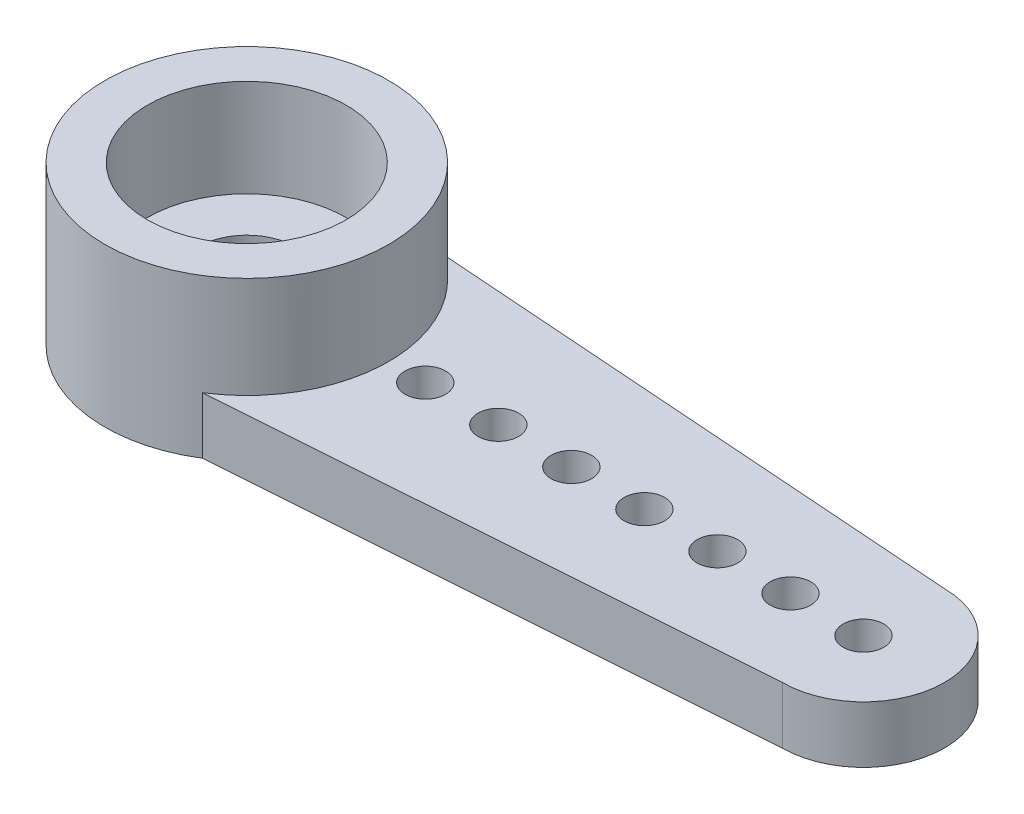
ISO-10303-21;
HEADER;
FILE_DESCRIPTION(('STEP AP214'),'2;1');
FILE_NAME('part.step','',(''),(''),'','','');
FILE_SCHEMA(('AUTOMOTIVE_DESIGN { 1 0 10303 214 1 1 1 1 }'));
ENDSEC;
DATA;
#1=APPLICATION_CONTEXT('core data for automotive mechanical design processes');
#2=APPLICATION_PROTOCOL_DEFINITION('international standard','automotive_design',2000,#1);
#3=PRODUCT_CONTEXT('',#1,'mechanical');
#4=PRODUCT('Part','Part','',(#3));
#5=PRODUCT_RELATED_PRODUCT_CATEGORY('part','',(#4));
#6=PRODUCT_DEFINITION_FORMATION('','',#4);
#7=PRODUCT_DEFINITION_CONTEXT('part definition',#1,'design');
#8=PRODUCT_DEFINITION('design','',#6,#7);
#9=PRODUCT_DEFINITION_SHAPE('','',#8);
#10=(LENGTH_UNIT() NAMED_UNIT(*) SI_UNIT(.MILLI.,.METRE.));
#11=(NAMED_UNIT(*) PLANE_ANGLE_UNIT() SI_UNIT($,.RADIAN.));
#12=(NAMED_UNIT(*) SI_UNIT($,.STERADIAN.) SOLID_ANGLE_UNIT());
#13=UNCERTAINTY_MEASURE_WITH_UNIT(LENGTH_MEASURE(1.E-05),#10,'distance_accuracy_value','');
#14=(GEOMETRIC_REPRESENTATION_CONTEXT(3) GLOBAL_UNCERTAINTY_ASSIGNED_CONTEXT((#13)) GLOBAL_UNIT_ASSIGNED_CONTEXT((#10,
#11,#12)) REPRESENTATION_CONTEXT('',''));
#15=CARTESIAN_POINT('',(0.,0.,0.));
#16=DIRECTION('',(0.,0.,1.));
#17=DIRECTION('',(1.,0.,0.));
#18=AXIS2_PLACEMENT_3D('',#15,#16,#17);
#19=CARTESIAN_POINT('',(-15.2,1.4,0.));
#20=DIRECTION('',(0.,1.,0.));
#21=DIRECTION('',(0.,0.,1.));
#22=AXIS2_PLACEMENT_3D('',#19,#20,#21);
#23=PLANE('',#22);
#24=CARTESIAN_POINT('',(6.2,1.4,0.));
#25=DIRECTION('',(0.,1.,0.));
#26=DIRECTION('',(0.,0.,1.));
#27=AXIS2_PLACEMENT_3D('',#24,#25,#26);
#28=CIRCLE('',#27,0.499999999999997);
#29=CARTESIAN_POINT('',(6.2,1.4,0.500000000000053));
#30=VERTEX_POINT('',#29);
#31=EDGE_CURVE('E129',#30,#30,#28,.T.);
#32=ORIENTED_EDGE('',*,*,#31,.F.);
#33=EDGE_LOOP('',(#32));
#34=FACE_BOUND('',#33,.T.);
#35=CARTESIAN_POINT('',(9.8,1.4,0.));
#36=DIRECTION('',(0.,1.,0.));
#37=DIRECTION('',(0.,0.,1.));
#38=AXIS2_PLACEMENT_3D('',#35,#36,#37);
#39=CIRCLE('',#38,0.499999999999997);
#40=CARTESIAN_POINT('',(9.8,1.4,0.500000000000028));
#41=VERTEX_POINT('',#40);
#42=EDGE_CURVE('E141',#41,#41,#39,.T.);
#43=ORIENTED_EDGE('',*,*,#42,.F.);
#44=EDGE_LOOP('',(#43));
#45=FACE_BOUND('',#44,.T.);
#46=CARTESIAN_POINT('',(13.4,1.4,0.));
#47=DIRECTION('',(0.,1.,0.));
#48=DIRECTION('',(0.,0.,1.));
#49=AXIS2_PLACEMENT_3D('',#46,#47,#48);
#50=CIRCLE('',#49,0.499999999999997);
#51=CARTESIAN_POINT('',(13.4,1.4,0.500000000000003));
#52=VERTEX_POINT('',#51);
#53=EDGE_CURVE('E153',#52,#52,#50,.T.);
#54=ORIENTED_EDGE('',*,*,#53,.F.);
#55=EDGE_LOOP('',(#54));
#56=FACE_BOUND('',#55,.T.);
#57=CARTESIAN_POINT('',(15.2,1.4,0.));
#58=DIRECTION('',(0.,1.,0.));
#59=DIRECTION('',(0.,0.,1.));
#60=AXIS2_PLACEMENT_3D('',#57,#58,#59);
#61=CIRCLE('',#60,0.499999999999997);
#62=CARTESIAN_POINT('',(15.2,1.4,0.49999999999999));
#63=VERTEX_POINT('',#62);
#64=EDGE_CURVE('E159',#63,#63,#61,.T.);
#65=ORIENTED_EDGE('',*,*,#64,.F.);
#66=EDGE_LOOP('',(#65));
#67=FACE_BOUND('',#66,.T.);
#68=CARTESIAN_POINT('',(11.6,1.4,0.));
#69=DIRECTION('',(0.,1.,0.));
#70=DIRECTION('',(0.,0.,1.));
#71=AXIS2_PLACEMENT_3D('',#68,#69,#70);
#72=CIRCLE('',#71,0.499999999999999);
#73=CARTESIAN_POINT('',(11.6,1.4,0.500000000000017));
#74=VERTEX_POINT('',#73);
#75=EDGE_CURVE('E147',#74,#74,#72,.T.);
#76=ORIENTED_EDGE('',*,*,#75,.F.);
#77=EDGE_LOOP('',(#76));
#78=FACE_BOUND('',#77,.T.);
#79=CARTESIAN_POINT('',(8.,1.4,0.));
#80=DIRECTION('',(0.,1.,0.));
#81=DIRECTION('',(0.,0.,1.));
#82=AXIS2_PLACEMENT_3D('',#79,#80,#81);
#83=CIRCLE('',#82,0.499999999999997);
#84=CARTESIAN_POINT('',(8.,1.4,0.500000000000041));
#85=VERTEX_POINT('',#84);
#86=EDGE_CURVE('E135',#85,#85,#83,.T.);
#87=ORIENTED_EDGE('',*,*,#86,.F.);
#88=EDGE_LOOP('',(#87));
#89=FACE_BOUND('',#88,.T.);
#90=CARTESIAN_POINT('',(4.4,1.4,0.));
#91=DIRECTION('',(0.,1.,0.));
#92=DIRECTION('',(0.,0.,1.));
#93=AXIS2_PLACEMENT_3D('',#90,#91,#92);
#94=CIRCLE('',#93,0.499999999999997);
#95=CARTESIAN_POINT('',(4.4,1.4,0.500000000000066));
#96=VERTEX_POINT('',#95);
#97=EDGE_CURVE('E123',#96,#96,#94,.T.);
#98=ORIENTED_EDGE('',*,*,#97,.F.);
#99=EDGE_LOOP('',(#98));
#100=FACE_BOUND('',#99,.T.);
#101=CARTESIAN_POINT('',(0.,1.4,0.));
#102=DIRECTION('',(0.,1.,0.));
#103=DIRECTION('',(0.,0.,1.));
#104=AXIS2_PLACEMENT_3D('',#101,#102,#103);
#105=CIRCLE('',#104,3.5);
#106=CARTESIAN_POINT('',(1.86858471289894,1.4,2.95945791838985));
#107=VERTEX_POINT('',#106);
#108=CARTESIAN_POINT('',(1.86858471289894,1.4,-2.95945791838985));
#109=VERTEX_POINT('',#108);
#110=EDGE_CURVE('E89',#107,#109,#105,.T.);
#111=ORIENTED_EDGE('',*,*,#110,.F.);
#112=DIRECTION('',(0.997420198870011,0.,-0.0717840294641297));
#113=VECTOR('',#112,1.);
#114=CARTESIAN_POINT('',(-14.9001527327747,1.4,4.16629887091939));
#115=LINE('',#114,#113);
#116=CARTESIAN_POINT('',(15.2,1.4,2.));
#117=VERTEX_POINT('',#116);
#118=EDGE_CURVE('E103',#107,#117,#115,.T.);
#119=ORIENTED_EDGE('',*,*,#118,.T.);
#120=CARTESIAN_POINT('',(15.2,1.4,0.));
#121=DIRECTION('',(0.,1.,0.));
#122=DIRECTION('',(0.,0.,-1.));
#123=AXIS2_PLACEMENT_3D('',#120,#121,#122);
#124=CIRCLE('',#123,2.);
#125=CARTESIAN_POINT('',(15.2,1.4,-2.));
#126=VERTEX_POINT('',#125);
#127=EDGE_CURVE('E165',#117,#126,#124,.T.);
#128=ORIENTED_EDGE('',*,*,#127,.T.);
#129=DIRECTION('',(-0.997420198870011,0.,-0.0717840294641295));
#130=VECTOR('',#129,1.);
#131=CARTESIAN_POINT('',(-14.9001527327747,1.4,-4.16629887091939));
#132=LINE('',#131,#130);
#133=EDGE_CURVE('E100',#126,#109,#132,.T.);
#134=ORIENTED_EDGE('',*,*,#133,.T.);
#135=EDGE_LOOP('',(#111,#119,#128,#134));
#136=FACE_BOUND('',#135,.T.);
#137=ADVANCED_FACE('F36',(#34,#45,#56,#67,#78,#89,#100,#136),#23,.T.);
#138=CARTESIAN_POINT('',(-15.2,0.,0.));
#139=DIRECTION('',(0.,1.,0.));
#140=DIRECTION('',(0.,0.,1.));
#141=AXIS2_PLACEMENT_3D('',#138,#139,#140);
#142=PLANE('',#141);
#143=CARTESIAN_POINT('',(0.,0.,0.));
#144=DIRECTION('',(0.,-1.,0.));
#145=DIRECTION('',(0.,0.,-1.));
#146=AXIS2_PLACEMENT_3D('',#143,#144,#145);
#147=CIRCLE('',#146,2.35);
#148=CARTESIAN_POINT('',(0.,0.,-2.35));
#149=VERTEX_POINT('',#148);
#150=EDGE_CURVE('E115',#149,#149,#147,.T.);
#151=ORIENTED_EDGE('',*,*,#150,.F.);
#152=EDGE_LOOP('',(#151));
#153=FACE_BOUND('',#152,.T.);
#154=CARTESIAN_POINT('',(15.2,0.,0.));
#155=DIRECTION('',(0.,1.,0.));
#156=DIRECTION('',(0.,0.,1.));
#157=AXIS2_PLACEMENT_3D('',#154,#155,#156);
#158=CIRCLE('',#157,0.499999999999997);
#159=CARTESIAN_POINT('',(15.2,0.,0.49999999999999));
#160=VERTEX_POINT('',#159);
#161=EDGE_CURVE('E156',#160,#160,#158,.T.);
#162=ORIENTED_EDGE('',*,*,#161,.T.);
#163=EDGE_LOOP('',(#162));
#164=FACE_BOUND('',#163,.T.);
#165=CARTESIAN_POINT('',(13.4,0.,0.));
#166=DIRECTION('',(0.,1.,0.));
#167=DIRECTION('',(0.,0.,1.));
#168=AXIS2_PLACEMENT_3D('',#165,#166,#167);
#169=CIRCLE('',#168,0.499999999999997);
#170=CARTESIAN_POINT('',(13.4,0.,0.500000000000003));
#171=VERTEX_POINT('',#170);
#172=EDGE_CURVE('E150',#171,#171,#169,.T.);
#173=ORIENTED_EDGE('',*,*,#172,.T.);
#174=EDGE_LOOP('',(#173));
#175=FACE_BOUND('',#174,.T.);
#176=CARTESIAN_POINT('',(11.6,0.,0.));
#177=DIRECTION('',(0.,1.,0.));
#178=DIRECTION('',(0.,0.,1.));
#179=AXIS2_PLACEMENT_3D('',#176,#177,#178);
#180=CIRCLE('',#179,0.499999999999999);
#181=CARTESIAN_POINT('',(11.6,0.,0.500000000000017));
#182=VERTEX_POINT('',#181);
#183=EDGE_CURVE('E144',#182,#182,#180,.T.);
#184=ORIENTED_EDGE('',*,*,#183,.T.);
#185=EDGE_LOOP('',(#184));
#186=FACE_BOUND('',#185,.T.);
#187=CARTESIAN_POINT('',(9.8,0.,0.));
#188=DIRECTION('',(0.,1.,0.));
#189=DIRECTION('',(0.,0.,1.));
#190=AXIS2_PLACEMENT_3D('',#187,#188,#189);
#191=CIRCLE('',#190,0.499999999999997);
#192=CARTESIAN_POINT('',(9.8,0.,0.500000000000028));
#193=VERTEX_POINT('',#192);
#194=EDGE_CURVE('E138',#193,#193,#191,.T.);
#195=ORIENTED_EDGE('',*,*,#194,.T.);
#196=EDGE_LOOP('',(#195));
#197=FACE_BOUND('',#196,.T.);
#198=CARTESIAN_POINT('',(8.,0.,0.));
#199=DIRECTION('',(0.,1.,0.));
#200=DIRECTION('',(0.,0.,1.));
#201=AXIS2_PLACEMENT_3D('',#198,#199,#200);
#202=CIRCLE('',#201,0.499999999999997);
#203=CARTESIAN_POINT('',(8.,0.,0.500000000000041));
#204=VERTEX_POINT('',#203);
#205=EDGE_CURVE('E132',#204,#204,#202,.T.);
#206=ORIENTED_EDGE('',*,*,#205,.T.);
#207=EDGE_LOOP('',(#206));
#208=FACE_BOUND('',#207,.T.);
#209=CARTESIAN_POINT('',(6.2,0.,0.));
#210=DIRECTION('',(0.,1.,0.));
#211=DIRECTION('',(0.,0.,1.));
#212=AXIS2_PLACEMENT_3D('',#209,#210,#211);
#213=CIRCLE('',#212,0.499999999999997);
#214=CARTESIAN_POINT('',(6.2,0.,0.500000000000053));
#215=VERTEX_POINT('',#214);
#216=EDGE_CURVE('E126',#215,#215,#213,.T.);
#217=ORIENTED_EDGE('',*,*,#216,.T.);
#218=EDGE_LOOP('',(#217));
#219=FACE_BOUND('',#218,.T.);
#220=CARTESIAN_POINT('',(4.4,0.,0.));
#221=DIRECTION('',(0.,1.,0.));
#222=DIRECTION('',(0.,0.,1.));
#223=AXIS2_PLACEMENT_3D('',#220,#221,#222);
#224=CIRCLE('',#223,0.499999999999997);
#225=CARTESIAN_POINT('',(4.4,0.,0.500000000000066));
#226=VERTEX_POINT('',#225);
#227=EDGE_CURVE('E120',#226,#226,#224,.T.);
#228=ORIENTED_EDGE('',*,*,#227,.T.);
#229=EDGE_LOOP('',(#228));
#230=FACE_BOUND('',#229,.T.);
#231=CARTESIAN_POINT('',(0.,0.,0.));
#232=DIRECTION('',(0.,-1.,0.));
#233=DIRECTION('',(0.,0.,-1.));
#234=AXIS2_PLACEMENT_3D('',#231,#232,#233);
#235=CIRCLE('',#234,3.5);
#236=CARTESIAN_POINT('',(1.86858471289894,0.,2.95945791838985));
#237=VERTEX_POINT('',#236);
#238=CARTESIAN_POINT('',(1.86858471289894,0.,-2.95945791838985));
#239=VERTEX_POINT('',#238);
#240=EDGE_CURVE('E74',#237,#239,#235,.T.);
#241=ORIENTED_EDGE('',*,*,#240,.T.);
#242=DIRECTION('',(0.997420198870011,0.,0.0717840294641295));
#243=VECTOR('',#242,1.);
#244=CARTESIAN_POINT('',(1.86858471289894,0.,-2.95945791838985));
#245=LINE('',#244,#243);
#246=CARTESIAN_POINT('',(15.2,0.,-2.));
#247=VERTEX_POINT('',#246);
#248=EDGE_CURVE('E79',#239,#247,#245,.T.);
#249=ORIENTED_EDGE('',*,*,#248,.T.);
#250=CARTESIAN_POINT('',(15.2,0.,0.));
#251=DIRECTION('',(0.,1.,0.));
#252=DIRECTION('',(0.,0.,-1.));
#253=AXIS2_PLACEMENT_3D('',#250,#251,#252);
#254=CIRCLE('',#253,2.);
#255=CARTESIAN_POINT('',(15.2,0.,1.99999999999999));
#256=VERTEX_POINT('',#255);
#257=EDGE_CURVE('E162',#256,#247,#254,.T.);
#258=ORIENTED_EDGE('',*,*,#257,.F.);
#259=DIRECTION('',(-0.997420198870011,0.,0.0717840294641296));
#260=VECTOR('',#259,1.);
#261=CARTESIAN_POINT('',(15.2,0.,2.));
#262=LINE('',#261,#260);
#263=EDGE_CURVE('E51',#256,#237,#262,.T.);
#264=ORIENTED_EDGE('',*,*,#263,.T.);
#265=EDGE_LOOP('',(#241,#249,#258,#264));
#266=FACE_BOUND('',#265,.T.);
#267=ADVANCED_FACE('F76',(#153,#164,#175,#186,#197,#208,#219,#230,#266),#142,.F.);
#268=CARTESIAN_POINT('',(15.2,1.4,0.));
#269=DIRECTION('',(0.,-1.,0.));
#270=DIRECTION('',(0.,0.,-1.));
#271=AXIS2_PLACEMENT_3D('',#268,#269,#270);
#272=CYLINDRICAL_SURFACE('',#271,2.);
#273=ORIENTED_EDGE('',*,*,#257,.T.);
#274=DIRECTION('',(0.,-1.,0.));
#275=VECTOR('',#274,1.);
#276=CARTESIAN_POINT('',(15.2,1.4,-2.00000000000001));
#277=LINE('',#276,#275);
#278=EDGE_CURVE('E96',#126,#247,#277,.T.);
#279=ORIENTED_EDGE('',*,*,#278,.F.);
#280=ORIENTED_EDGE('',*,*,#127,.F.);
#281=DIRECTION('',(0.,-1.,0.));
#282=VECTOR('',#281,1.);
#283=CARTESIAN_POINT('',(15.2,1.4,1.99999999999999));
#284=LINE('',#283,#282);
#285=EDGE_CURVE('E44',#117,#256,#284,.T.);
#286=ORIENTED_EDGE('',*,*,#285,.T.);
#287=EDGE_LOOP('',(#273,#279,#280,#286));
#288=FACE_BOUND('',#287,.T.);
#289=ADVANCED_FACE('F38',(#288),#272,.T.);
#290=CARTESIAN_POINT('',(15.2,1.4,0.));
#291=DIRECTION('',(0.,-1.,0.));
#292=DIRECTION('',(0.,0.,-1.));
#293=AXIS2_PLACEMENT_3D('',#290,#291,#292);
#294=CYLINDRICAL_SURFACE('',#293,0.499999999999997);
#295=ORIENTED_EDGE('',*,*,#64,.T.);
#296=EDGE_LOOP('',(#295));
#297=FACE_BOUND('',#296,.T.);
#298=ORIENTED_EDGE('',*,*,#161,.F.);
#299=EDGE_LOOP('',(#298));
#300=FACE_BOUND('',#299,.T.);
#301=ADVANCED_FACE('F224',(#297,#300),#294,.F.);
#302=CARTESIAN_POINT('',(13.4,1.4,0.));
#303=DIRECTION('',(0.,-1.,0.));
#304=DIRECTION('',(0.,0.,-1.));
#305=AXIS2_PLACEMENT_3D('',#302,#303,#304);
#306=CYLINDRICAL_SURFACE('',#305,0.499999999999997);
#307=ORIENTED_EDGE('',*,*,#53,.T.);
#308=EDGE_LOOP('',(#307));
#309=FACE_BOUND('',#308,.T.);
#310=ORIENTED_EDGE('',*,*,#172,.F.);
#311=EDGE_LOOP('',(#310));
#312=FACE_BOUND('',#311,.T.);
#313=ADVANCED_FACE('F227',(#309,#312),#306,.F.);
#314=CARTESIAN_POINT('',(11.6,1.4,0.));
#315=DIRECTION('',(0.,-1.,0.));
#316=DIRECTION('',(0.,0.,-1.));
#317=AXIS2_PLACEMENT_3D('',#314,#315,#316);
#318=CYLINDRICAL_SURFACE('',#317,0.499999999999999);
#319=ORIENTED_EDGE('',*,*,#75,.T.);
#320=EDGE_LOOP('',(#319));
#321=FACE_BOUND('',#320,.T.);
#322=ORIENTED_EDGE('',*,*,#183,.F.);
#323=EDGE_LOOP('',(#322));
#324=FACE_BOUND('',#323,.T.);
#325=ADVANCED_FACE('F231',(#321,#324),#318,.F.);
#326=CARTESIAN_POINT('',(9.8,1.4,0.));
#327=DIRECTION('',(0.,-1.,0.));
#328=DIRECTION('',(0.,0.,-1.));
#329=AXIS2_PLACEMENT_3D('',#326,#327,#328);
#330=CYLINDRICAL_SURFACE('',#329,0.499999999999997);
#331=ORIENTED_EDGE('',*,*,#42,.T.);
#332=EDGE_LOOP('',(#331));
#333=FACE_BOUND('',#332,.T.);
#334=ORIENTED_EDGE('',*,*,#194,.F.);
#335=EDGE_LOOP('',(#334));
#336=FACE_BOUND('',#335,.T.);
#337=ADVANCED_FACE('F235',(#333,#336),#330,.F.);
#338=CARTESIAN_POINT('',(8.,1.4,0.));
#339=DIRECTION('',(0.,-1.,0.));
#340=DIRECTION('',(0.,0.,-1.));
#341=AXIS2_PLACEMENT_3D('',#338,#339,#340);
#342=CYLINDRICAL_SURFACE('',#341,0.499999999999997);
#343=ORIENTED_EDGE('',*,*,#86,.T.);
#344=EDGE_LOOP('',(#343));
#345=FACE_BOUND('',#344,.T.);
#346=ORIENTED_EDGE('',*,*,#205,.F.);
#347=EDGE_LOOP('',(#346));
#348=FACE_BOUND('',#347,.T.);
#349=ADVANCED_FACE('F213',(#345,#348),#342,.F.);
#350=CARTESIAN_POINT('',(6.2,1.4,0.));
#351=DIRECTION('',(0.,-1.,0.));
#352=DIRECTION('',(0.,0.,-1.));
#353=AXIS2_PLACEMENT_3D('',#350,#351,#352);
#354=CYLINDRICAL_SURFACE('',#353,0.499999999999997);
#355=ORIENTED_EDGE('',*,*,#31,.T.);
#356=EDGE_LOOP('',(#355));
#357=FACE_BOUND('',#356,.T.);
#358=ORIENTED_EDGE('',*,*,#216,.F.);
#359=EDGE_LOOP('',(#358));
#360=FACE_BOUND('',#359,.T.);
#361=ADVANCED_FACE('F207',(#357,#360),#354,.F.);
#362=CARTESIAN_POINT('',(4.4,1.4,0.));
#363=DIRECTION('',(0.,-1.,0.));
#364=DIRECTION('',(0.,0.,-1.));
#365=AXIS2_PLACEMENT_3D('',#362,#363,#364);
#366=CYLINDRICAL_SURFACE('',#365,0.499999999999997);
#367=ORIENTED_EDGE('',*,*,#97,.T.);
#368=EDGE_LOOP('',(#367));
#369=FACE_BOUND('',#368,.T.);
#370=ORIENTED_EDGE('',*,*,#227,.F.);
#371=EDGE_LOOP('',(#370));
#372=FACE_BOUND('',#371,.T.);
#373=ADVANCED_FACE('F186',(#369,#372),#366,.F.);
#374=CARTESIAN_POINT('',(0.,1.,0.));
#375=DIRECTION('',(0.,-1.,0.));
#376=DIRECTION('',(0.,0.,-1.));
#377=AXIS2_PLACEMENT_3D('',#374,#375,#376);
#378=CYLINDRICAL_SURFACE('',#377,2.35);
#379=CARTESIAN_POINT('',(0.,1.,0.));
#380=DIRECTION('',(0.,-1.,0.));
#381=DIRECTION('',(0.,0.,-1.));
#382=AXIS2_PLACEMENT_3D('',#379,#380,#381);
#383=CIRCLE('',#382,2.35);
#384=CARTESIAN_POINT('',(0.,1.,-2.35));
#385=VERTEX_POINT('',#384);
#386=EDGE_CURVE('E117',#385,#385,#383,.T.);
#387=ORIENTED_EDGE('',*,*,#386,.F.);
#388=EDGE_LOOP('',(#387));
#389=FACE_BOUND('',#388,.T.);
#390=ORIENTED_EDGE('',*,*,#150,.T.);
#391=EDGE_LOOP('',(#390));
#392=FACE_BOUND('',#391,.T.);
#393=ADVANCED_FACE('F180',(#389,#392),#378,.F.);
#394=CARTESIAN_POINT('',(0.,1.,0.));
#395=DIRECTION('',(0.,-1.,0.));
#396=DIRECTION('',(0.,0.,-1.));
#397=AXIS2_PLACEMENT_3D('',#394,#395,#396);
#398=PLANE('',#397);
#399=CARTESIAN_POINT('',(0.,1.,0.));
#400=DIRECTION('',(0.,-1.,0.));
#401=DIRECTION('',(0.,0.,-1.));
#402=AXIS2_PLACEMENT_3D('',#399,#400,#401);
#403=CIRCLE('',#402,1.2);
#404=CARTESIAN_POINT('',(0.,1.,-1.2));
#405=VERTEX_POINT('',#404);
#406=EDGE_CURVE('E108',#405,#405,#403,.T.);
#407=ORIENTED_EDGE('',*,*,#406,.F.);
#408=EDGE_LOOP('',(#407));
#409=FACE_BOUND('',#408,.T.);
#410=ORIENTED_EDGE('',*,*,#386,.T.);
#411=EDGE_LOOP('',(#410));
#412=FACE_BOUND('',#411,.T.);
#413=ADVANCED_FACE('F176',(#409,#412),#398,.T.);
#414=CARTESIAN_POINT('',(0.,3.9,0.));
#415=DIRECTION('',(0.,1.,0.));
#416=DIRECTION('',(0.,0.,1.));
#417=AXIS2_PLACEMENT_3D('',#414,#415,#416);
#418=PLANE('',#417);
#419=CARTESIAN_POINT('',(0.,3.9,0.));
#420=DIRECTION('',(0.,1.,0.));
#421=DIRECTION('',(0.,0.,1.));
#422=AXIS2_PLACEMENT_3D('',#419,#420,#421);
#423=CIRCLE('',#422,3.5);
#424=CARTESIAN_POINT('',(0.,3.9,3.5));
#425=VERTEX_POINT('',#424);
#426=EDGE_CURVE('E112',#425,#425,#423,.T.);
#427=ORIENTED_EDGE('',*,*,#426,.T.);
#428=EDGE_LOOP('',(#427));
#429=FACE_BOUND('',#428,.T.);
#430=CARTESIAN_POINT('',(0.,3.9,0.));
#431=DIRECTION('',(0.,1.,0.));
#432=DIRECTION('',(0.,0.,1.));
#433=AXIS2_PLACEMENT_3D('',#430,#431,#432);
#434=CIRCLE('',#433,2.45);
#435=CARTESIAN_POINT('',(0.,3.9,2.45));
#436=VERTEX_POINT('',#435);
#437=EDGE_CURVE('E109',#436,#436,#434,.T.);
#438=ORIENTED_EDGE('',*,*,#437,.F.);
#439=EDGE_LOOP('',(#438));
#440=FACE_BOUND('',#439,.T.);
#441=ADVANCED_FACE('F179',(#429,#440),#418,.T.);
#442=CARTESIAN_POINT('',(0.,3.9,0.));
#443=DIRECTION('',(0.,-1.,0.));
#444=DIRECTION('',(0.,0.,-1.));
#445=AXIS2_PLACEMENT_3D('',#442,#443,#444);
#446=CYLINDRICAL_SURFACE('',#445,3.5);
#447=DIRECTION('',(0.,-1.,0.));
#448=VECTOR('',#447,1.);
#449=CARTESIAN_POINT('',(1.86858471289894,3.9,-2.95945791838985));
#450=LINE('',#449,#448);
#451=EDGE_CURVE('E83',#109,#239,#450,.T.);
#452=ORIENTED_EDGE('',*,*,#451,.T.);
#453=ORIENTED_EDGE('',*,*,#240,.F.);
#454=DIRECTION('',(0.,-1.,0.));
#455=VECTOR('',#454,1.);
#456=CARTESIAN_POINT('',(1.86858471289894,3.9,2.95945791838985));
#457=LINE('',#456,#455);
#458=EDGE_CURVE('E92',#107,#237,#457,.T.);
#459=ORIENTED_EDGE('',*,*,#458,.F.);
#460=ORIENTED_EDGE('',*,*,#110,.T.);
#461=EDGE_LOOP('',(#452,#453,#459,#460));
#462=FACE_BOUND('',#461,.T.);
#463=ORIENTED_EDGE('',*,*,#426,.F.);
#464=EDGE_LOOP('',(#463));
#465=FACE_BOUND('',#464,.T.);
#466=ADVANCED_FACE('F86',(#462,#465),#446,.T.);
#467=CARTESIAN_POINT('',(0.,3.9,0.));
#468=DIRECTION('',(0.,-1.,0.));
#469=DIRECTION('',(0.,0.,-1.));
#470=AXIS2_PLACEMENT_3D('',#467,#468,#469);
#471=CYLINDRICAL_SURFACE('',#470,2.45);
#472=CARTESIAN_POINT('',(0.,1.5,0.));
#473=DIRECTION('',(0.,1.,0.));
#474=DIRECTION('',(0.,0.,1.));
#475=AXIS2_PLACEMENT_3D('',#472,#473,#474);
#476=CIRCLE('',#475,2.45);
#477=CARTESIAN_POINT('',(0.,1.5,2.45));
#478=VERTEX_POINT('',#477);
#479=EDGE_CURVE('E11',#478,#478,#476,.T.);
#480=ORIENTED_EDGE('',*,*,#479,.F.);
#481=EDGE_LOOP('',(#480));
#482=FACE_BOUND('',#481,.T.);
#483=ORIENTED_EDGE('',*,*,#437,.T.);
#484=EDGE_LOOP('',(#483));
#485=FACE_BOUND('',#484,.T.);
#486=ADVANCED_FACE('F307',(#482,#485),#471,.F.);
#487=CARTESIAN_POINT('',(0.,0.,0.));
#488=DIRECTION('',(0.,1.,0.));
#489=DIRECTION('',(0.,0.,1.));
#490=AXIS2_PLACEMENT_3D('',#487,#488,#489);
#491=CYLINDRICAL_SURFACE('',#490,1.2);
#492=ORIENTED_EDGE('',*,*,#406,.T.);
#493=EDGE_LOOP('',(#492));
#494=FACE_BOUND('',#493,.T.);
#495=CARTESIAN_POINT('',(0.,1.5,0.));
#496=DIRECTION('',(0.,1.,0.));
#497=DIRECTION('',(0.,0.,1.));
#498=AXIS2_PLACEMENT_3D('',#495,#496,#497);
#499=CIRCLE('',#498,1.2);
#500=CARTESIAN_POINT('',(0.,1.5,1.2));
#501=VERTEX_POINT('',#500);
#502=EDGE_CURVE('E105',#501,#501,#499,.T.);
#503=ORIENTED_EDGE('',*,*,#502,.T.);
#504=EDGE_LOOP('',(#503));
#505=FACE_BOUND('',#504,.T.);
#506=ADVANCED_FACE('F173',(#494,#505),#491,.F.);
#507=CARTESIAN_POINT('',(0.,1.5,0.));
#508=DIRECTION('',(0.,1.,0.));
#509=DIRECTION('',(0.,0.,1.));
#510=AXIS2_PLACEMENT_3D('',#507,#508,#509);
#511=PLANE('',#510);
#512=ORIENTED_EDGE('',*,*,#479,.T.);
#513=EDGE_LOOP('',(#512));
#514=FACE_BOUND('',#513,.T.);
#515=ORIENTED_EDGE('',*,*,#502,.F.);
#516=EDGE_LOOP('',(#515));
#517=FACE_BOUND('',#516,.T.);
#518=ADVANCED_FACE('F324',(#514,#517),#511,.T.);
#519=CARTESIAN_POINT('',(1.86858471289894,3.9,-2.95945791838985));
#520=DIRECTION('',(0.0717840294641295,0.,-0.997420198870011));
#521=DIRECTION('',(-0.997420198870011,0.,-0.0717840294641295));
#522=AXIS2_PLACEMENT_3D('',#519,#520,#521);
#523=PLANE('',#522);
#524=ORIENTED_EDGE('',*,*,#278,.T.);
#525=ORIENTED_EDGE('',*,*,#248,.F.);
#526=ORIENTED_EDGE('',*,*,#451,.F.);
#527=ORIENTED_EDGE('',*,*,#133,.F.);
#528=EDGE_LOOP('',(#524,#525,#526,#527));
#529=FACE_BOUND('',#528,.T.);
#530=ADVANCED_FACE('F94',(#529),#523,.T.);
#531=CARTESIAN_POINT('',(15.2,3.9,2.));
#532=DIRECTION('',(0.0717840294641297,0.,0.997420198870011));
#533=DIRECTION('',(0.997420198870011,0.,-0.0717840294641297));
#534=AXIS2_PLACEMENT_3D('',#531,#532,#533);
#535=PLANE('',#534);
#536=ORIENTED_EDGE('',*,*,#458,.T.);
#537=ORIENTED_EDGE('',*,*,#263,.F.);
#538=ORIENTED_EDGE('',*,*,#285,.F.);
#539=ORIENTED_EDGE('',*,*,#118,.F.);
#540=EDGE_LOOP('',(#536,#537,#538,#539));
#541=FACE_BOUND('',#540,.T.);
#542=ADVANCED_FACE('F362',(#541),#535,.T.);
#543=CLOSED_SHELL('',(#137,#267,#289,#301,#313,#325,#337,#349,#361,#373,#393,#413,#441,#466,
#486,#506,#518,#530,#542));
#544=MANIFOLD_SOLID_BREP('B2',#543);
#545=ADVANCED_BREP_SHAPE_REPRESENTATION('',(#18,#544),#14);
#546=SHAPE_DEFINITION_REPRESENTATION(#9,#545);
ENDSEC;
END-ISO-10303-21;
